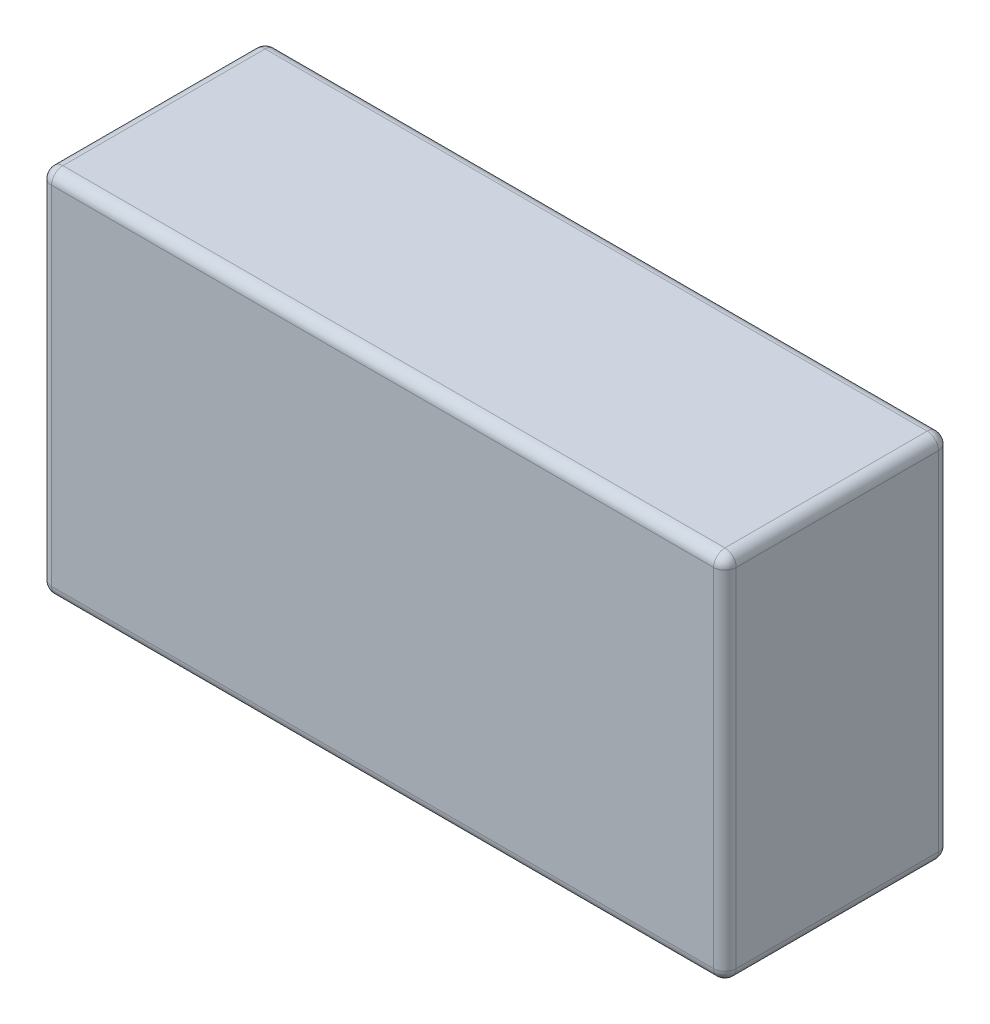
ISO-10303-21;
HEADER;
FILE_DESCRIPTION(('STEP AP214'),'2;1');
FILE_NAME('part.step','',(''),(''),'','','');
FILE_SCHEMA(('AUTOMOTIVE_DESIGN { 1 0 10303 214 1 1 1 1 }'));
ENDSEC;
DATA;
#1=APPLICATION_CONTEXT('core data for automotive mechanical design processes');
#2=APPLICATION_PROTOCOL_DEFINITION('international standard','automotive_design',2000,#1);
#3=PRODUCT_CONTEXT('',#1,'mechanical');
#4=PRODUCT('Part','Part','',(#3));
#5=PRODUCT_RELATED_PRODUCT_CATEGORY('part','',(#4));
#6=PRODUCT_DEFINITION_FORMATION('','',#4);
#7=PRODUCT_DEFINITION_CONTEXT('part definition',#1,'design');
#8=PRODUCT_DEFINITION('design','',#6,#7);
#9=PRODUCT_DEFINITION_SHAPE('','',#8);
#10=(LENGTH_UNIT() NAMED_UNIT(*) SI_UNIT(.MILLI.,.METRE.));
#11=(NAMED_UNIT(*) PLANE_ANGLE_UNIT() SI_UNIT($,.RADIAN.));
#12=(NAMED_UNIT(*) SI_UNIT($,.STERADIAN.) SOLID_ANGLE_UNIT());
#13=UNCERTAINTY_MEASURE_WITH_UNIT(LENGTH_MEASURE(1.E-05),#10,'distance_accuracy_value','');
#14=(GEOMETRIC_REPRESENTATION_CONTEXT(3) GLOBAL_UNCERTAINTY_ASSIGNED_CONTEXT((#13)) GLOBAL_UNIT_ASSIGNED_CONTEXT((#10,
#11,#12)) REPRESENTATION_CONTEXT('',''));
#15=CARTESIAN_POINT('',(0.,0.,0.));
#16=DIRECTION('',(0.,0.,1.));
#17=DIRECTION('',(1.,0.,0.));
#18=AXIS2_PLACEMENT_3D('',#15,#16,#17);
#19=CARTESIAN_POINT('',(0.,0.,39.8));
#20=DIRECTION('',(-1.,0.,0.));
#21=DIRECTION('',(0.,0.,1.));
#22=AXIS2_PLACEMENT_3D('',#19,#20,#21);
#23=PLANE('',#22);
#24=DIRECTION('',(0.,0.,-1.));
#25=VECTOR('',#24,1.);
#26=CARTESIAN_POINT('',(0.,63.5,39.8));
#27=LINE('',#26,#25);
#28=CARTESIAN_POINT('',(0.,63.5,37.8));
#29=VERTEX_POINT('',#28);
#30=CARTESIAN_POINT('',(0.,63.5,2.));
#31=VERTEX_POINT('',#30);
#32=EDGE_CURVE('E167',#29,#31,#27,.T.);
#33=ORIENTED_EDGE('',*,*,#32,.T.);
#34=DIRECTION('',(0.,1.,0.));
#35=VECTOR('',#34,1.);
#36=CARTESIAN_POINT('',(0.,0.,2.));
#37=LINE('',#36,#35);
#38=CARTESIAN_POINT('',(0.,2.,2.));
#39=VERTEX_POINT('',#38);
#40=EDGE_CURVE('E169',#31,#39,#37,.F.);
#41=ORIENTED_EDGE('',*,*,#40,.T.);
#42=DIRECTION('',(0.,0.,-1.));
#43=VECTOR('',#42,1.);
#44=CARTESIAN_POINT('',(0.,2.,39.8));
#45=LINE('',#44,#43);
#46=CARTESIAN_POINT('',(0.,2.,37.8));
#47=VERTEX_POINT('',#46);
#48=EDGE_CURVE('E165',#39,#47,#45,.F.);
#49=ORIENTED_EDGE('',*,*,#48,.T.);
#50=DIRECTION('',(0.,1.,0.));
#51=VECTOR('',#50,1.);
#52=CARTESIAN_POINT('',(0.,65.5,37.8));
#53=LINE('',#52,#51);
#54=EDGE_CURVE('E163',#47,#29,#53,.T.);
#55=ORIENTED_EDGE('',*,*,#54,.T.);
#56=EDGE_LOOP('',(#33,#41,#49,#55));
#57=FACE_BOUND('',#56,.T.);
#58=ADVANCED_FACE('F33',(#57),#23,.T.);
#59=CARTESIAN_POINT('',(0.,0.,39.8));
#60=DIRECTION('',(0.,1.,0.));
#61=DIRECTION('',(0.,0.,1.));
#62=AXIS2_PLACEMENT_3D('',#59,#60,#61);
#63=PLANE('',#62);
#64=DIRECTION('',(0.,0.,-1.));
#65=VECTOR('',#64,1.);
#66=CARTESIAN_POINT('',(2.,0.,0.));
#67=LINE('',#66,#65);
#68=CARTESIAN_POINT('',(2.,0.,37.8));
#69=VERTEX_POINT('',#68);
#70=CARTESIAN_POINT('',(2.,0.,2.));
#71=VERTEX_POINT('',#70);
#72=EDGE_CURVE('E193',#69,#71,#67,.T.);
#73=ORIENTED_EDGE('',*,*,#72,.T.);
#74=DIRECTION('',(1.,0.,0.));
#75=VECTOR('',#74,1.);
#76=CARTESIAN_POINT('',(121.2,0.,2.));
#77=LINE('',#76,#75);
#78=CARTESIAN_POINT('',(119.2,0.,2.));
#79=VERTEX_POINT('',#78);
#80=EDGE_CURVE('E196',#71,#79,#77,.T.);
#81=ORIENTED_EDGE('',*,*,#80,.T.);
#82=DIRECTION('',(0.,0.,-1.));
#83=VECTOR('',#82,1.);
#84=CARTESIAN_POINT('',(119.2,0.,39.8));
#85=LINE('',#84,#83);
#86=CARTESIAN_POINT('',(119.2,0.,37.8));
#87=VERTEX_POINT('',#86);
#88=EDGE_CURVE('E191',#79,#87,#85,.F.);
#89=ORIENTED_EDGE('',*,*,#88,.T.);
#90=DIRECTION('',(1.,0.,0.));
#91=VECTOR('',#90,1.);
#92=CARTESIAN_POINT('',(0.,0.,37.8));
#93=LINE('',#92,#91);
#94=EDGE_CURVE('E189',#87,#69,#93,.F.);
#95=ORIENTED_EDGE('',*,*,#94,.T.);
#96=EDGE_LOOP('',(#73,#81,#89,#95));
#97=FACE_BOUND('',#96,.T.);
#98=ADVANCED_FACE('F308',(#97),#63,.F.);
#99=CARTESIAN_POINT('',(121.2,0.,39.8));
#100=DIRECTION('',(-1.,0.,0.));
#101=DIRECTION('',(0.,0.,1.));
#102=AXIS2_PLACEMENT_3D('',#99,#100,#101);
#103=PLANE('',#102);
#104=DIRECTION('',(0.,1.,0.));
#105=VECTOR('',#104,1.);
#106=CARTESIAN_POINT('',(121.2,65.5,2.));
#107=LINE('',#106,#105);
#108=CARTESIAN_POINT('',(121.2,2.,2.));
#109=VERTEX_POINT('',#108);
#110=CARTESIAN_POINT('',(121.2,63.5,2.));
#111=VERTEX_POINT('',#110);
#112=EDGE_CURVE('E138',#109,#111,#107,.T.);
#113=ORIENTED_EDGE('',*,*,#112,.T.);
#114=DIRECTION('',(0.,0.,-1.));
#115=VECTOR('',#114,1.);
#116=CARTESIAN_POINT('',(121.2,63.5,39.8));
#117=LINE('',#116,#115);
#118=CARTESIAN_POINT('',(121.2,63.5,37.8));
#119=VERTEX_POINT('',#118);
#120=EDGE_CURVE('E186',#111,#119,#117,.F.);
#121=ORIENTED_EDGE('',*,*,#120,.T.);
#122=DIRECTION('',(0.,1.,0.));
#123=VECTOR('',#122,1.);
#124=CARTESIAN_POINT('',(121.2,0.,37.8));
#125=LINE('',#124,#123);
#126=CARTESIAN_POINT('',(121.2,2.,37.8));
#127=VERTEX_POINT('',#126);
#128=EDGE_CURVE('E181',#119,#127,#125,.F.);
#129=ORIENTED_EDGE('',*,*,#128,.T.);
#130=DIRECTION('',(0.,0.,-1.));
#131=VECTOR('',#130,1.);
#132=CARTESIAN_POINT('',(121.2,2.,39.8));
#133=LINE('',#132,#131);
#134=EDGE_CURVE('E183',#127,#109,#133,.T.);
#135=ORIENTED_EDGE('',*,*,#134,.T.);
#136=EDGE_LOOP('',(#113,#121,#129,#135));
#137=FACE_BOUND('',#136,.T.);
#138=ADVANCED_FACE('F261',(#137),#103,.F.);
#139=CARTESIAN_POINT('',(0.,65.5,39.8));
#140=DIRECTION('',(0.,1.,0.));
#141=DIRECTION('',(0.,0.,1.));
#142=AXIS2_PLACEMENT_3D('',#139,#140,#141);
#143=PLANE('',#142);
#144=DIRECTION('',(1.,0.,0.));
#145=VECTOR('',#144,1.);
#146=CARTESIAN_POINT('',(0.,65.5,2.));
#147=LINE('',#146,#145);
#148=CARTESIAN_POINT('',(119.2,65.5,2.));
#149=VERTEX_POINT('',#148);
#150=CARTESIAN_POINT('',(2.,65.5,2.));
#151=VERTEX_POINT('',#150);
#152=EDGE_CURVE('E176',#149,#151,#147,.F.);
#153=ORIENTED_EDGE('',*,*,#152,.T.);
#154=DIRECTION('',(0.,0.,-1.));
#155=VECTOR('',#154,1.);
#156=CARTESIAN_POINT('',(2.,65.5,39.8));
#157=LINE('',#156,#155);
#158=CARTESIAN_POINT('',(2.,65.5,37.8));
#159=VERTEX_POINT('',#158);
#160=EDGE_CURVE('E178',#151,#159,#157,.F.);
#161=ORIENTED_EDGE('',*,*,#160,.T.);
#162=DIRECTION('',(1.,0.,0.));
#163=VECTOR('',#162,1.);
#164=CARTESIAN_POINT('',(121.2,65.5,37.8));
#165=LINE('',#164,#163);
#166=CARTESIAN_POINT('',(119.2,65.5,37.8));
#167=VERTEX_POINT('',#166);
#168=EDGE_CURVE('E172',#159,#167,#165,.T.);
#169=ORIENTED_EDGE('',*,*,#168,.T.);
#170=DIRECTION('',(0.,0.,-1.));
#171=VECTOR('',#170,1.);
#172=CARTESIAN_POINT('',(119.2,65.5,0.));
#173=LINE('',#172,#171);
#174=EDGE_CURVE('E174',#167,#149,#173,.T.);
#175=ORIENTED_EDGE('',*,*,#174,.T.);
#176=EDGE_LOOP('',(#153,#161,#169,#175));
#177=FACE_BOUND('',#176,.T.);
#178=ADVANCED_FACE('F274',(#177),#143,.T.);
#179=CARTESIAN_POINT('',(0.,0.,39.8));
#180=DIRECTION('',(0.,0.,-1.));
#181=DIRECTION('',(-1.,0.,0.));
#182=AXIS2_PLACEMENT_3D('',#179,#180,#181);
#183=PLANE('',#182);
#184=DIRECTION('',(0.,1.,0.));
#185=VECTOR('',#184,1.);
#186=CARTESIAN_POINT('',(119.2,0.,39.8));
#187=LINE('',#186,#185);
#188=CARTESIAN_POINT('',(119.2,2.,39.8));
#189=VERTEX_POINT('',#188);
#190=CARTESIAN_POINT('',(119.2,63.5,39.8));
#191=VERTEX_POINT('',#190);
#192=EDGE_CURVE('E42',#189,#191,#187,.T.);
#193=ORIENTED_EDGE('',*,*,#192,.T.);
#194=DIRECTION('',(1.,0.,0.));
#195=VECTOR('',#194,1.);
#196=CARTESIAN_POINT('',(0.,63.5,39.8));
#197=LINE('',#196,#195);
#198=CARTESIAN_POINT('',(2.,63.5,39.8));
#199=VERTEX_POINT('',#198);
#200=EDGE_CURVE('E11',#191,#199,#197,.F.);
#201=ORIENTED_EDGE('',*,*,#200,.T.);
#202=DIRECTION('',(0.,1.,0.));
#203=VECTOR('',#202,1.);
#204=CARTESIAN_POINT('',(2.,0.,39.8));
#205=LINE('',#204,#203);
#206=CARTESIAN_POINT('',(2.,2.,39.8));
#207=VERTEX_POINT('',#206);
#208=EDGE_CURVE('E198',#199,#207,#205,.F.);
#209=ORIENTED_EDGE('',*,*,#208,.T.);
#210=DIRECTION('',(1.,0.,0.));
#211=VECTOR('',#210,1.);
#212=CARTESIAN_POINT('',(0.,2.,39.8));
#213=LINE('',#212,#211);
#214=EDGE_CURVE('E53',#207,#189,#213,.T.);
#215=ORIENTED_EDGE('',*,*,#214,.T.);
#216=EDGE_LOOP('',(#193,#201,#209,#215));
#217=FACE_BOUND('',#216,.T.);
#218=ADVANCED_FACE('F289',(#217),#183,.F.);
#219=CARTESIAN_POINT('',(0.,0.,0.));
#220=DIRECTION('',(0.,0.,-1.));
#221=DIRECTION('',(-1.,0.,0.));
#222=AXIS2_PLACEMENT_3D('',#219,#220,#221);
#223=PLANE('',#222);
#224=DIRECTION('',(1.,0.,0.));
#225=VECTOR('',#224,1.);
#226=CARTESIAN_POINT('',(0.,2.,0.));
#227=LINE('',#226,#225);
#228=CARTESIAN_POINT('',(119.2,2.,0.));
#229=VERTEX_POINT('',#228);
#230=CARTESIAN_POINT('',(2.,2.,0.));
#231=VERTEX_POINT('',#230);
#232=EDGE_CURVE('E125',#229,#231,#227,.F.);
#233=ORIENTED_EDGE('',*,*,#232,.T.);
#234=DIRECTION('',(0.,1.,0.));
#235=VECTOR('',#234,1.);
#236=CARTESIAN_POINT('',(2.,0.,0.));
#237=LINE('',#236,#235);
#238=CARTESIAN_POINT('',(2.,63.5,0.));
#239=VERTEX_POINT('',#238);
#240=EDGE_CURVE('E161',#231,#239,#237,.T.);
#241=ORIENTED_EDGE('',*,*,#240,.T.);
#242=DIRECTION('',(1.,0.,0.));
#243=VECTOR('',#242,1.);
#244=CARTESIAN_POINT('',(0.,63.5,0.));
#245=LINE('',#244,#243);
#246=CARTESIAN_POINT('',(119.2,63.5,0.));
#247=VERTEX_POINT('',#246);
#248=EDGE_CURVE('E128',#239,#247,#245,.T.);
#249=ORIENTED_EDGE('',*,*,#248,.T.);
#250=DIRECTION('',(0.,1.,0.));
#251=VECTOR('',#250,1.);
#252=CARTESIAN_POINT('',(119.2,0.,0.));
#253=LINE('',#252,#251);
#254=EDGE_CURVE('E120',#247,#229,#253,.F.);
#255=ORIENTED_EDGE('',*,*,#254,.T.);
#256=EDGE_LOOP('',(#233,#241,#249,#255));
#257=FACE_BOUND('',#256,.T.);
#258=ADVANCED_FACE('F122',(#257),#223,.T.);
#259=CARTESIAN_POINT('',(119.2,0.,37.8));
#260=DIRECTION('',(0.,1.,0.));
#261=DIRECTION('',(0.,0.,1.));
#262=AXIS2_PLACEMENT_3D('',#259,#260,#261);
#263=CYLINDRICAL_SURFACE('',#262,2.);
#264=CARTESIAN_POINT('',(119.2,2.,37.8));
#265=DIRECTION('',(0.,-1.,0.));
#266=DIRECTION('',(0.,0.,-1.));
#267=AXIS2_PLACEMENT_3D('',#264,#265,#266);
#268=CIRCLE('',#267,2.);
#269=EDGE_CURVE('E37',#127,#189,#268,.T.);
#270=ORIENTED_EDGE('',*,*,#269,.F.);
#271=ORIENTED_EDGE('',*,*,#128,.F.);
#272=CARTESIAN_POINT('',(119.2,63.5,37.8));
#273=DIRECTION('',(0.,1.,0.));
#274=DIRECTION('',(0.,0.,1.));
#275=AXIS2_PLACEMENT_3D('',#272,#273,#274);
#276=CIRCLE('',#275,2.);
#277=EDGE_CURVE('E158',#191,#119,#276,.T.);
#278=ORIENTED_EDGE('',*,*,#277,.F.);
#279=ORIENTED_EDGE('',*,*,#192,.F.);
#280=EDGE_LOOP('',(#270,#271,#278,#279));
#281=FACE_BOUND('',#280,.T.);
#282=ADVANCED_FACE('F35',(#281),#263,.T.);
#283=CARTESIAN_POINT('',(119.2,2.,37.8));
#284=DIRECTION('',(0.,0.,1.));
#285=DIRECTION('',(1.,0.,0.));
#286=AXIS2_PLACEMENT_3D('',#283,#284,#285);
#287=SPHERICAL_SURFACE('',#286,2.);
#288=CARTESIAN_POINT('',(119.2,2.,37.8));
#289=DIRECTION('',(0.,0.,1.));
#290=DIRECTION('',(1.,0.,0.));
#291=AXIS2_PLACEMENT_3D('',#288,#289,#290);
#292=CIRCLE('',#291,2.);
#293=EDGE_CURVE('E243',#127,#87,#292,.F.);
#294=ORIENTED_EDGE('',*,*,#293,.F.);
#295=ORIENTED_EDGE('',*,*,#269,.T.);
#296=CARTESIAN_POINT('',(119.2,2.,37.8));
#297=DIRECTION('',(1.,0.,0.));
#298=DIRECTION('',(0.,0.,-1.));
#299=AXIS2_PLACEMENT_3D('',#296,#297,#298);
#300=CIRCLE('',#299,2.);
#301=EDGE_CURVE('E246',#87,#189,#300,.F.);
#302=ORIENTED_EDGE('',*,*,#301,.F.);
#303=EDGE_LOOP('',(#294,#295,#302));
#304=FACE_BOUND('',#303,.T.);
#305=ADVANCED_FACE('F314',(#304),#287,.T.);
#306=CARTESIAN_POINT('',(119.2,63.5,37.8));
#307=DIRECTION('',(0.,0.,1.));
#308=DIRECTION('',(1.,0.,0.));
#309=AXIS2_PLACEMENT_3D('',#306,#307,#308);
#310=SPHERICAL_SURFACE('',#309,2.);
#311=CARTESIAN_POINT('',(119.2,63.5,37.8));
#312=DIRECTION('',(1.,0.,0.));
#313=DIRECTION('',(0.,0.,-1.));
#314=AXIS2_PLACEMENT_3D('',#311,#312,#313);
#315=CIRCLE('',#314,2.);
#316=EDGE_CURVE('E238',#191,#167,#315,.F.);
#317=ORIENTED_EDGE('',*,*,#316,.F.);
#318=ORIENTED_EDGE('',*,*,#277,.T.);
#319=CARTESIAN_POINT('',(119.2,63.5,37.8));
#320=DIRECTION('',(0.,0.,1.));
#321=DIRECTION('',(1.,0.,0.));
#322=AXIS2_PLACEMENT_3D('',#319,#320,#321);
#323=CIRCLE('',#322,2.);
#324=EDGE_CURVE('E241',#167,#119,#323,.F.);
#325=ORIENTED_EDGE('',*,*,#324,.F.);
#326=EDGE_LOOP('',(#317,#318,#325));
#327=FACE_BOUND('',#326,.T.);
#328=ADVANCED_FACE('F253',(#327),#310,.T.);
#329=CARTESIAN_POINT('',(0.,2.,37.8));
#330=DIRECTION('',(1.,0.,0.));
#331=DIRECTION('',(0.,0.,-1.));
#332=AXIS2_PLACEMENT_3D('',#329,#330,#331);
#333=CYLINDRICAL_SURFACE('',#332,2.);
#334=ORIENTED_EDGE('',*,*,#301,.T.);
#335=ORIENTED_EDGE('',*,*,#214,.F.);
#336=CARTESIAN_POINT('',(2.,2.,37.8));
#337=DIRECTION('',(-1.,0.,0.));
#338=DIRECTION('',(0.,0.,1.));
#339=AXIS2_PLACEMENT_3D('',#336,#337,#338);
#340=CIRCLE('',#339,2.);
#341=EDGE_CURVE('E232',#69,#207,#340,.T.);
#342=ORIENTED_EDGE('',*,*,#341,.F.);
#343=ORIENTED_EDGE('',*,*,#94,.F.);
#344=EDGE_LOOP('',(#334,#335,#342,#343));
#345=FACE_BOUND('',#344,.T.);
#346=ADVANCED_FACE('F294',(#345),#333,.T.);
#347=CARTESIAN_POINT('',(119.2,2.,39.8));
#348=DIRECTION('',(0.,0.,-1.));
#349=DIRECTION('',(-1.,0.,0.));
#350=AXIS2_PLACEMENT_3D('',#347,#348,#349);
#351=CYLINDRICAL_SURFACE('',#350,2.);
#352=ORIENTED_EDGE('',*,*,#293,.T.);
#353=ORIENTED_EDGE('',*,*,#88,.F.);
#354=CARTESIAN_POINT('',(119.2,2.,2.));
#355=DIRECTION('',(0.,0.,-1.));
#356=DIRECTION('',(-1.,0.,0.));
#357=AXIS2_PLACEMENT_3D('',#354,#355,#356);
#358=CIRCLE('',#357,2.);
#359=EDGE_CURVE('E142',#109,#79,#358,.T.);
#360=ORIENTED_EDGE('',*,*,#359,.F.);
#361=ORIENTED_EDGE('',*,*,#134,.F.);
#362=EDGE_LOOP('',(#352,#353,#360,#361));
#363=FACE_BOUND('',#362,.T.);
#364=ADVANCED_FACE('F312',(#363),#351,.T.);
#365=CARTESIAN_POINT('',(119.2,0.,2.));
#366=DIRECTION('',(0.,-1.,0.));
#367=DIRECTION('',(0.,0.,-1.));
#368=AXIS2_PLACEMENT_3D('',#365,#366,#367);
#369=CYLINDRICAL_SURFACE('',#368,2.);
#370=CARTESIAN_POINT('',(119.2,63.5,2.));
#371=DIRECTION('',(0.,1.,0.));
#372=DIRECTION('',(0.,0.,1.));
#373=AXIS2_PLACEMENT_3D('',#370,#371,#372);
#374=CIRCLE('',#373,2.);
#375=EDGE_CURVE('E143',#111,#247,#374,.T.);
#376=ORIENTED_EDGE('',*,*,#375,.F.);
#377=ORIENTED_EDGE('',*,*,#112,.F.);
#378=CARTESIAN_POINT('',(119.2,2.,2.));
#379=DIRECTION('',(0.,-1.,0.));
#380=DIRECTION('',(1.,0.,0.));
#381=AXIS2_PLACEMENT_3D('',#378,#379,#380);
#382=CIRCLE('',#381,2.);
#383=EDGE_CURVE('E135',#229,#109,#382,.T.);
#384=ORIENTED_EDGE('',*,*,#383,.F.);
#385=ORIENTED_EDGE('',*,*,#254,.F.);
#386=EDGE_LOOP('',(#376,#377,#384,#385));
#387=FACE_BOUND('',#386,.T.);
#388=ADVANCED_FACE('F137',(#387),#369,.T.);
#389=CARTESIAN_POINT('',(119.2,63.5,39.8));
#390=DIRECTION('',(0.,0.,1.));
#391=DIRECTION('',(1.,0.,0.));
#392=AXIS2_PLACEMENT_3D('',#389,#390,#391);
#393=CYLINDRICAL_SURFACE('',#392,2.);
#394=ORIENTED_EDGE('',*,*,#324,.T.);
#395=ORIENTED_EDGE('',*,*,#120,.F.);
#396=CARTESIAN_POINT('',(119.2,63.5,2.));
#397=DIRECTION('',(0.,0.,-1.));
#398=DIRECTION('',(-1.,0.,0.));
#399=AXIS2_PLACEMENT_3D('',#396,#397,#398);
#400=CIRCLE('',#399,2.);
#401=EDGE_CURVE('E227',#149,#111,#400,.T.);
#402=ORIENTED_EDGE('',*,*,#401,.F.);
#403=ORIENTED_EDGE('',*,*,#174,.F.);
#404=EDGE_LOOP('',(#394,#395,#402,#403));
#405=FACE_BOUND('',#404,.T.);
#406=ADVANCED_FACE('F264',(#405),#393,.T.);
#407=CARTESIAN_POINT('',(0.,63.5,37.8));
#408=DIRECTION('',(-1.,0.,0.));
#409=DIRECTION('',(0.,0.,1.));
#410=AXIS2_PLACEMENT_3D('',#407,#408,#409);
#411=CYLINDRICAL_SURFACE('',#410,2.);
#412=ORIENTED_EDGE('',*,*,#316,.T.);
#413=ORIENTED_EDGE('',*,*,#168,.F.);
#414=CARTESIAN_POINT('',(2.,63.5,37.8));
#415=DIRECTION('',(-1.,0.,0.));
#416=DIRECTION('',(0.,0.,1.));
#417=AXIS2_PLACEMENT_3D('',#414,#415,#416);
#418=CIRCLE('',#417,2.);
#419=EDGE_CURVE('E224',#199,#159,#418,.T.);
#420=ORIENTED_EDGE('',*,*,#419,.F.);
#421=ORIENTED_EDGE('',*,*,#200,.F.);
#422=EDGE_LOOP('',(#412,#413,#420,#421));
#423=FACE_BOUND('',#422,.T.);
#424=ADVANCED_FACE('F288',(#423),#411,.T.);
#425=CARTESIAN_POINT('',(2.,0.,37.8));
#426=DIRECTION('',(0.,-1.,0.));
#427=DIRECTION('',(0.,0.,-1.));
#428=AXIS2_PLACEMENT_3D('',#425,#426,#427);
#429=CYLINDRICAL_SURFACE('',#428,2.);
#430=CARTESIAN_POINT('',(2.,2.,37.8));
#431=DIRECTION('',(0.,-1.,0.));
#432=DIRECTION('',(0.,0.,-1.));
#433=AXIS2_PLACEMENT_3D('',#430,#431,#432);
#434=CIRCLE('',#433,2.);
#435=EDGE_CURVE('E235',#207,#47,#434,.T.);
#436=ORIENTED_EDGE('',*,*,#435,.F.);
#437=ORIENTED_EDGE('',*,*,#208,.F.);
#438=CARTESIAN_POINT('',(2.,63.5,37.8));
#439=DIRECTION('',(0.,1.,0.));
#440=DIRECTION('',(0.,0.,1.));
#441=AXIS2_PLACEMENT_3D('',#438,#439,#440);
#442=CIRCLE('',#441,2.);
#443=EDGE_CURVE('E222',#29,#199,#442,.T.);
#444=ORIENTED_EDGE('',*,*,#443,.F.);
#445=ORIENTED_EDGE('',*,*,#54,.F.);
#446=EDGE_LOOP('',(#436,#437,#444,#445));
#447=FACE_BOUND('',#446,.T.);
#448=ADVANCED_FACE('F299',(#447),#429,.T.);
#449=CARTESIAN_POINT('',(2.,2.,37.8));
#450=DIRECTION('',(0.,0.,1.));
#451=DIRECTION('',(1.,0.,0.));
#452=AXIS2_PLACEMENT_3D('',#449,#450,#451);
#453=SPHERICAL_SURFACE('',#452,2.);
#454=ORIENTED_EDGE('',*,*,#341,.T.);
#455=ORIENTED_EDGE('',*,*,#435,.T.);
#456=CARTESIAN_POINT('',(2.,2.,37.8));
#457=DIRECTION('',(0.,0.,1.));
#458=DIRECTION('',(1.,0.,0.));
#459=AXIS2_PLACEMENT_3D('',#456,#457,#458);
#460=CIRCLE('',#459,2.);
#461=EDGE_CURVE('E150',#69,#47,#460,.F.);
#462=ORIENTED_EDGE('',*,*,#461,.F.);
#463=EDGE_LOOP('',(#454,#455,#462));
#464=FACE_BOUND('',#463,.T.);
#465=ADVANCED_FACE('F301',(#464),#453,.T.);
#466=CARTESIAN_POINT('',(119.2,2.,2.));
#467=DIRECTION('',(0.,0.,1.));
#468=DIRECTION('',(1.,0.,0.));
#469=AXIS2_PLACEMENT_3D('',#466,#467,#468);
#470=SPHERICAL_SURFACE('',#469,2.);
#471=ORIENTED_EDGE('',*,*,#383,.T.);
#472=ORIENTED_EDGE('',*,*,#359,.T.);
#473=CARTESIAN_POINT('',(119.2,2.,2.));
#474=DIRECTION('',(1.,0.,0.));
#475=DIRECTION('',(0.,0.,-1.));
#476=AXIS2_PLACEMENT_3D('',#473,#474,#475);
#477=CIRCLE('',#476,2.);
#478=EDGE_CURVE('E146',#229,#79,#477,.F.);
#479=ORIENTED_EDGE('',*,*,#478,.F.);
#480=EDGE_LOOP('',(#471,#472,#479));
#481=FACE_BOUND('',#480,.T.);
#482=ADVANCED_FACE('F147',(#481),#470,.T.);
#483=CARTESIAN_POINT('',(119.2,63.5,2.));
#484=DIRECTION('',(0.,0.,1.));
#485=DIRECTION('',(1.,0.,0.));
#486=AXIS2_PLACEMENT_3D('',#483,#484,#485);
#487=SPHERICAL_SURFACE('',#486,2.);
#488=ORIENTED_EDGE('',*,*,#401,.T.);
#489=ORIENTED_EDGE('',*,*,#375,.T.);
#490=CARTESIAN_POINT('',(119.2,63.5,2.));
#491=DIRECTION('',(1.,0.,0.));
#492=DIRECTION('',(0.,0.,-1.));
#493=AXIS2_PLACEMENT_3D('',#490,#491,#492);
#494=CIRCLE('',#493,2.);
#495=EDGE_CURVE('E151',#149,#247,#494,.F.);
#496=ORIENTED_EDGE('',*,*,#495,.F.);
#497=EDGE_LOOP('',(#488,#489,#496));
#498=FACE_BOUND('',#497,.T.);
#499=ADVANCED_FACE('F267',(#498),#487,.T.);
#500=CARTESIAN_POINT('',(2.,63.5,37.8));
#501=DIRECTION('',(0.,0.,1.));
#502=DIRECTION('',(1.,0.,0.));
#503=AXIS2_PLACEMENT_3D('',#500,#501,#502);
#504=SPHERICAL_SURFACE('',#503,2.);
#505=ORIENTED_EDGE('',*,*,#443,.T.);
#506=ORIENTED_EDGE('',*,*,#419,.T.);
#507=CARTESIAN_POINT('',(2.,63.5,37.8));
#508=DIRECTION('',(0.,0.,1.));
#509=DIRECTION('',(1.,0.,0.));
#510=AXIS2_PLACEMENT_3D('',#507,#508,#509);
#511=CIRCLE('',#510,2.);
#512=EDGE_CURVE('E216',#29,#159,#511,.F.);
#513=ORIENTED_EDGE('',*,*,#512,.F.);
#514=EDGE_LOOP('',(#505,#506,#513));
#515=FACE_BOUND('',#514,.T.);
#516=ADVANCED_FACE('F284',(#515),#504,.T.);
#517=CARTESIAN_POINT('',(2.,2.,39.8));
#518=DIRECTION('',(0.,0.,1.));
#519=DIRECTION('',(1.,0.,0.));
#520=AXIS2_PLACEMENT_3D('',#517,#518,#519);
#521=CYLINDRICAL_SURFACE('',#520,2.);
#522=ORIENTED_EDGE('',*,*,#461,.T.);
#523=ORIENTED_EDGE('',*,*,#48,.F.);
#524=CARTESIAN_POINT('',(2.,2.,2.));
#525=DIRECTION('',(0.,0.,-1.));
#526=DIRECTION('',(-1.,0.,0.));
#527=AXIS2_PLACEMENT_3D('',#524,#525,#526);
#528=CIRCLE('',#527,2.);
#529=EDGE_CURVE('E213',#71,#39,#528,.T.);
#530=ORIENTED_EDGE('',*,*,#529,.F.);
#531=ORIENTED_EDGE('',*,*,#72,.F.);
#532=EDGE_LOOP('',(#522,#523,#530,#531));
#533=FACE_BOUND('',#532,.T.);
#534=ADVANCED_FACE('F306',(#533),#521,.T.);
#535=CARTESIAN_POINT('',(0.,2.,2.));
#536=DIRECTION('',(-1.,0.,0.));
#537=DIRECTION('',(0.,0.,1.));
#538=AXIS2_PLACEMENT_3D('',#535,#536,#537);
#539=CYLINDRICAL_SURFACE('',#538,2.);
#540=ORIENTED_EDGE('',*,*,#478,.T.);
#541=ORIENTED_EDGE('',*,*,#80,.F.);
#542=CARTESIAN_POINT('',(2.,2.,2.));
#543=DIRECTION('',(-1.,0.,0.));
#544=DIRECTION('',(0.,-1.,0.));
#545=AXIS2_PLACEMENT_3D('',#542,#543,#544);
#546=CIRCLE('',#545,2.);
#547=EDGE_CURVE('E154',#231,#71,#546,.T.);
#548=ORIENTED_EDGE('',*,*,#547,.F.);
#549=ORIENTED_EDGE('',*,*,#232,.F.);
#550=EDGE_LOOP('',(#540,#541,#548,#549));
#551=FACE_BOUND('',#550,.T.);
#552=ADVANCED_FACE('F153',(#551),#539,.T.);
#553=CARTESIAN_POINT('',(0.,63.5,2.));
#554=DIRECTION('',(1.,0.,0.));
#555=DIRECTION('',(0.,0.,-1.));
#556=AXIS2_PLACEMENT_3D('',#553,#554,#555);
#557=CYLINDRICAL_SURFACE('',#556,2.);
#558=ORIENTED_EDGE('',*,*,#495,.T.);
#559=ORIENTED_EDGE('',*,*,#248,.F.);
#560=CARTESIAN_POINT('',(2.,63.5,2.));
#561=DIRECTION('',(-1.,0.,0.));
#562=DIRECTION('',(0.,0.,1.));
#563=AXIS2_PLACEMENT_3D('',#560,#561,#562);
#564=CIRCLE('',#563,2.);
#565=EDGE_CURVE('E209',#151,#239,#564,.T.);
#566=ORIENTED_EDGE('',*,*,#565,.F.);
#567=ORIENTED_EDGE('',*,*,#152,.F.);
#568=EDGE_LOOP('',(#558,#559,#566,#567));
#569=FACE_BOUND('',#568,.T.);
#570=ADVANCED_FACE('F271',(#569),#557,.T.);
#571=CARTESIAN_POINT('',(2.,63.5,39.8));
#572=DIRECTION('',(0.,0.,-1.));
#573=DIRECTION('',(-1.,0.,0.));
#574=AXIS2_PLACEMENT_3D('',#571,#572,#573);
#575=CYLINDRICAL_SURFACE('',#574,2.);
#576=ORIENTED_EDGE('',*,*,#512,.T.);
#577=ORIENTED_EDGE('',*,*,#160,.F.);
#578=CARTESIAN_POINT('',(2.,63.5,2.));
#579=DIRECTION('',(0.,0.,-1.));
#580=DIRECTION('',(-1.,0.,0.));
#581=AXIS2_PLACEMENT_3D('',#578,#579,#580);
#582=CIRCLE('',#581,2.);
#583=EDGE_CURVE('E206',#31,#151,#582,.T.);
#584=ORIENTED_EDGE('',*,*,#583,.F.);
#585=ORIENTED_EDGE('',*,*,#32,.F.);
#586=EDGE_LOOP('',(#576,#577,#584,#585));
#587=FACE_BOUND('',#586,.T.);
#588=ADVANCED_FACE('F277',(#587),#575,.T.);
#589=CARTESIAN_POINT('',(2.,2.,2.));
#590=DIRECTION('',(0.,0.,1.));
#591=DIRECTION('',(1.,0.,0.));
#592=AXIS2_PLACEMENT_3D('',#589,#590,#591);
#593=SPHERICAL_SURFACE('',#592,2.);
#594=ORIENTED_EDGE('',*,*,#547,.T.);
#595=ORIENTED_EDGE('',*,*,#529,.T.);
#596=CARTESIAN_POINT('',(2.,2.,2.));
#597=DIRECTION('',(0.,-1.,0.));
#598=DIRECTION('',(0.,0.,-1.));
#599=AXIS2_PLACEMENT_3D('',#596,#597,#598);
#600=CIRCLE('',#599,2.);
#601=EDGE_CURVE('E204',#231,#39,#600,.F.);
#602=ORIENTED_EDGE('',*,*,#601,.F.);
#603=EDGE_LOOP('',(#594,#595,#602));
#604=FACE_BOUND('',#603,.T.);
#605=ADVANCED_FACE('F338',(#604),#593,.T.);
#606=CARTESIAN_POINT('',(2.,63.5,2.));
#607=DIRECTION('',(0.,0.,1.));
#608=DIRECTION('',(1.,0.,0.));
#609=AXIS2_PLACEMENT_3D('',#606,#607,#608);
#610=SPHERICAL_SURFACE('',#609,2.);
#611=ORIENTED_EDGE('',*,*,#583,.T.);
#612=ORIENTED_EDGE('',*,*,#565,.T.);
#613=CARTESIAN_POINT('',(2.,63.5,2.));
#614=DIRECTION('',(0.,1.,0.));
#615=DIRECTION('',(-1.,0.,0.));
#616=AXIS2_PLACEMENT_3D('',#613,#614,#615);
#617=CIRCLE('',#616,2.);
#618=EDGE_CURVE('E202',#31,#239,#617,.F.);
#619=ORIENTED_EDGE('',*,*,#618,.F.);
#620=EDGE_LOOP('',(#611,#612,#619));
#621=FACE_BOUND('',#620,.T.);
#622=ADVANCED_FACE('F334',(#621),#610,.T.);
#623=CARTESIAN_POINT('',(2.,0.,2.));
#624=DIRECTION('',(0.,1.,0.));
#625=DIRECTION('',(0.,0.,1.));
#626=AXIS2_PLACEMENT_3D('',#623,#624,#625);
#627=CYLINDRICAL_SURFACE('',#626,2.);
#628=ORIENTED_EDGE('',*,*,#601,.T.);
#629=ORIENTED_EDGE('',*,*,#40,.F.);
#630=ORIENTED_EDGE('',*,*,#618,.T.);
#631=ORIENTED_EDGE('',*,*,#240,.F.);
#632=EDGE_LOOP('',(#628,#629,#630,#631));
#633=FACE_BOUND('',#632,.T.);
#634=ADVANCED_FACE('F331',(#633),#627,.T.);
#635=CLOSED_SHELL('',(#58,#98,#138,#178,#218,#258,#282,#305,#328,#346,#364,#388,#406,#424,#448,
#465,#482,#499,#516,#534,#552,#570,#588,#605,#622,#634));
#636=MANIFOLD_SOLID_BREP('B2',#635);
#637=ADVANCED_BREP_SHAPE_REPRESENTATION('',(#18,#636),#14);
#638=SHAPE_DEFINITION_REPRESENTATION(#9,#637);
ENDSEC;
END-ISO-10303-21;
